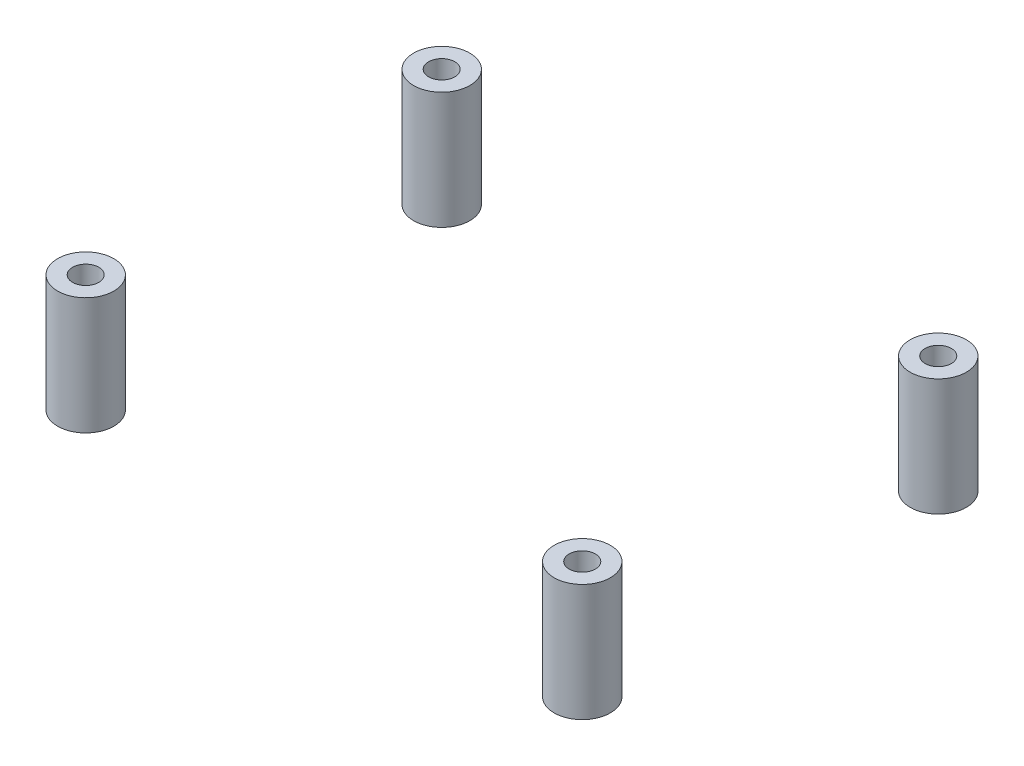
ISO-10303-21;
HEADER;
FILE_DESCRIPTION(('STEP AP214'),'2;1');
FILE_NAME('part.step','',(''),(''),'','','');
FILE_SCHEMA(('AUTOMOTIVE_DESIGN { 1 0 10303 214 1 1 1 1 }'));
ENDSEC;
DATA;
#1=APPLICATION_CONTEXT('core data for automotive mechanical design processes');
#2=APPLICATION_PROTOCOL_DEFINITION('international standard','automotive_design',2000,#1);
#3=PRODUCT_CONTEXT('',#1,'mechanical');
#4=PRODUCT('Part','Part','',(#3));
#5=PRODUCT_RELATED_PRODUCT_CATEGORY('part','',(#4));
#6=PRODUCT_DEFINITION_FORMATION('','',#4);
#7=PRODUCT_DEFINITION_CONTEXT('part definition',#1,'design');
#8=PRODUCT_DEFINITION('design','',#6,#7);
#9=PRODUCT_DEFINITION_SHAPE('','',#8);
#10=(LENGTH_UNIT() NAMED_UNIT(*) SI_UNIT(.MILLI.,.METRE.));
#11=(NAMED_UNIT(*) PLANE_ANGLE_UNIT() SI_UNIT($,.RADIAN.));
#12=(NAMED_UNIT(*) SI_UNIT($,.STERADIAN.) SOLID_ANGLE_UNIT());
#13=UNCERTAINTY_MEASURE_WITH_UNIT(LENGTH_MEASURE(1.E-05),#10,'distance_accuracy_value','');
#14=(GEOMETRIC_REPRESENTATION_CONTEXT(3) GLOBAL_UNCERTAINTY_ASSIGNED_CONTEXT((#13)) GLOBAL_UNIT_ASSIGNED_CONTEXT((#10,
#11,#12)) REPRESENTATION_CONTEXT('',''));
#15=CARTESIAN_POINT('',(0.,0.,0.));
#16=DIRECTION('',(0.,0.,1.));
#17=DIRECTION('',(1.,0.,0.));
#18=AXIS2_PLACEMENT_3D('',#15,#16,#17);
#19=CARTESIAN_POINT('',(18.7647371005469,12.5,-23.928667677178));
#20=DIRECTION('',(0.,-1.,0.));
#21=DIRECTION('',(0.,0.,-1.));
#22=AXIS2_PLACEMENT_3D('',#19,#20,#21);
#23=CYLINDRICAL_SURFACE('',#22,3.);
#24=CARTESIAN_POINT('',(18.7647371005469,12.5,-23.928667677178));
#25=DIRECTION('',(0.,1.,0.));
#26=DIRECTION('',(0.,0.,1.));
#27=AXIS2_PLACEMENT_3D('',#24,#25,#26);
#28=CIRCLE('',#27,3.);
#29=CARTESIAN_POINT('',(18.7647371005469,12.5,-20.928667677178));
#30=VERTEX_POINT('',#29);
#31=EDGE_CURVE('E11',#30,#30,#28,.T.);
#32=ORIENTED_EDGE('',*,*,#31,.F.);
#33=EDGE_LOOP('',(#32));
#34=FACE_BOUND('',#33,.T.);
#35=CARTESIAN_POINT('',(18.7647371005469,0.,-23.928667677178));
#36=DIRECTION('',(0.,1.,0.));
#37=DIRECTION('',(0.,0.,1.));
#38=AXIS2_PLACEMENT_3D('',#35,#36,#37);
#39=CIRCLE('',#38,3.);
#40=CARTESIAN_POINT('',(18.7647371005469,0.,-20.928667677178));
#41=VERTEX_POINT('',#40);
#42=EDGE_CURVE('E51',#41,#41,#39,.T.);
#43=ORIENTED_EDGE('',*,*,#42,.T.);
#44=EDGE_LOOP('',(#43));
#45=FACE_BOUND('',#44,.T.);
#46=ADVANCED_FACE('F48',(#34,#45),#23,.T.);
#47=CARTESIAN_POINT('',(0.,12.5,0.));
#48=DIRECTION('',(0.,1.,0.));
#49=DIRECTION('',(0.,0.,1.));
#50=AXIS2_PLACEMENT_3D('',#47,#48,#49);
#51=PLANE('',#50);
#52=CARTESIAN_POINT('',(18.7647371005469,12.5,-23.928667677178));
#53=DIRECTION('',(0.,1.,0.));
#54=DIRECTION('',(0.,0.,1.));
#55=AXIS2_PLACEMENT_3D('',#52,#53,#54);
#56=CIRCLE('',#55,1.4);
#57=CARTESIAN_POINT('',(18.7647371005469,12.5,-22.528667677178));
#58=VERTEX_POINT('',#57);
#59=EDGE_CURVE('E58',#58,#58,#56,.T.);
#60=ORIENTED_EDGE('',*,*,#59,.F.);
#61=EDGE_LOOP('',(#60));
#62=FACE_BOUND('',#61,.T.);
#63=ORIENTED_EDGE('',*,*,#31,.T.);
#64=EDGE_LOOP('',(#63));
#65=FACE_BOUND('',#64,.T.);
#66=ADVANCED_FACE('F68',(#62,#65),#51,.T.);
#67=CARTESIAN_POINT('',(0.,0.,0.));
#68=DIRECTION('',(0.,1.,0.));
#69=DIRECTION('',(0.,0.,1.));
#70=AXIS2_PLACEMENT_3D('',#67,#68,#69);
#71=PLANE('',#70);
#72=ORIENTED_EDGE('',*,*,#42,.F.);
#73=EDGE_LOOP('',(#72));
#74=FACE_BOUND('',#73,.T.);
#75=ADVANCED_FACE('F70',(#74),#71,.F.);
#76=CARTESIAN_POINT('',(18.7647371005469,2.5,-23.928667677178));
#77=DIRECTION('',(0.,1.,0.));
#78=DIRECTION('',(0.,0.,1.));
#79=AXIS2_PLACEMENT_3D('',#76,#77,#78);
#80=CYLINDRICAL_SURFACE('',#79,1.4);
#81=CARTESIAN_POINT('',(18.7647371005469,2.5,-23.928667677178));
#82=DIRECTION('',(0.,1.,0.));
#83=DIRECTION('',(0.,0.,1.));
#84=AXIS2_PLACEMENT_3D('',#81,#82,#83);
#85=CIRCLE('',#84,1.4);
#86=CARTESIAN_POINT('',(18.7647371005469,2.5,-22.528667677178));
#87=VERTEX_POINT('',#86);
#88=EDGE_CURVE('E60',#87,#87,#85,.T.);
#89=ORIENTED_EDGE('',*,*,#88,.F.);
#90=EDGE_LOOP('',(#89));
#91=FACE_BOUND('',#90,.T.);
#92=ORIENTED_EDGE('',*,*,#59,.T.);
#93=EDGE_LOOP('',(#92));
#94=FACE_BOUND('',#93,.T.);
#95=ADVANCED_FACE('F66',(#91,#94),#80,.F.);
#96=CARTESIAN_POINT('',(18.7647371005469,2.5,-23.928667677178));
#97=DIRECTION('',(0.,1.,0.));
#98=DIRECTION('',(0.,0.,1.));
#99=AXIS2_PLACEMENT_3D('',#96,#97,#98);
#100=PLANE('',#99);
#101=ORIENTED_EDGE('',*,*,#88,.T.);
#102=EDGE_LOOP('',(#101));
#103=FACE_BOUND('',#102,.T.);
#104=ADVANCED_FACE('F80',(#103),#100,.T.);
#105=CLOSED_SHELL('',(#46,#66,#75,#95,#104));
#106=MANIFOLD_SOLID_BREP('B2',#105);
#107=CARTESIAN_POINT('',(18.7647371005469,12.5,14.071332322822));
#108=DIRECTION('',(0.,-1.,0.));
#109=DIRECTION('',(0.,0.,-1.));
#110=AXIS2_PLACEMENT_3D('',#107,#108,#109);
#111=CYLINDRICAL_SURFACE('',#110,3.);
#112=CARTESIAN_POINT('',(18.7647371005469,12.5,14.071332322822));
#113=DIRECTION('',(0.,1.,0.));
#114=DIRECTION('',(0.,0.,1.));
#115=AXIS2_PLACEMENT_3D('',#112,#113,#114);
#116=CIRCLE('',#115,3.);
#117=CARTESIAN_POINT('',(18.7647371005469,12.5,17.071332322822));
#118=VERTEX_POINT('',#117);
#119=EDGE_CURVE('E47',#118,#118,#116,.T.);
#120=ORIENTED_EDGE('',*,*,#119,.F.);
#121=EDGE_LOOP('',(#120));
#122=FACE_BOUND('',#121,.T.);
#123=CARTESIAN_POINT('',(18.7647371005469,0.,14.071332322822));
#124=DIRECTION('',(0.,1.,0.));
#125=DIRECTION('',(0.,0.,1.));
#126=AXIS2_PLACEMENT_3D('',#123,#124,#125);
#127=CIRCLE('',#126,3.);
#128=CARTESIAN_POINT('',(18.7647371005469,0.,17.071332322822));
#129=VERTEX_POINT('',#128);
#130=EDGE_CURVE('E130',#129,#129,#127,.T.);
#131=ORIENTED_EDGE('',*,*,#130,.T.);
#132=EDGE_LOOP('',(#131));
#133=FACE_BOUND('',#132,.T.);
#134=ADVANCED_FACE('F127',(#122,#133),#111,.T.);
#135=CARTESIAN_POINT('',(0.,12.5,0.));
#136=DIRECTION('',(0.,1.,0.));
#137=DIRECTION('',(0.,0.,1.));
#138=AXIS2_PLACEMENT_3D('',#135,#136,#137);
#139=PLANE('',#138);
#140=CARTESIAN_POINT('',(18.7647371005469,12.5,14.071332322822));
#141=DIRECTION('',(0.,1.,0.));
#142=DIRECTION('',(0.,0.,1.));
#143=AXIS2_PLACEMENT_3D('',#140,#141,#142);
#144=CIRCLE('',#143,1.4);
#145=CARTESIAN_POINT('',(18.7647371005469,12.5,15.471332322822));
#146=VERTEX_POINT('',#145);
#147=EDGE_CURVE('E137',#146,#146,#144,.T.);
#148=ORIENTED_EDGE('',*,*,#147,.F.);
#149=EDGE_LOOP('',(#148));
#150=FACE_BOUND('',#149,.T.);
#151=ORIENTED_EDGE('',*,*,#119,.T.);
#152=EDGE_LOOP('',(#151));
#153=FACE_BOUND('',#152,.T.);
#154=ADVANCED_FACE('F147',(#150,#153),#139,.T.);
#155=CARTESIAN_POINT('',(0.,0.,0.));
#156=DIRECTION('',(0.,1.,0.));
#157=DIRECTION('',(0.,0.,1.));
#158=AXIS2_PLACEMENT_3D('',#155,#156,#157);
#159=PLANE('',#158);
#160=ORIENTED_EDGE('',*,*,#130,.F.);
#161=EDGE_LOOP('',(#160));
#162=FACE_BOUND('',#161,.T.);
#163=ADVANCED_FACE('F149',(#162),#159,.F.);
#164=CARTESIAN_POINT('',(18.7647371005469,2.5,14.071332322822));
#165=DIRECTION('',(0.,1.,0.));
#166=DIRECTION('',(0.,0.,1.));
#167=AXIS2_PLACEMENT_3D('',#164,#165,#166);
#168=CYLINDRICAL_SURFACE('',#167,1.4);
#169=CARTESIAN_POINT('',(18.7647371005469,2.5,14.071332322822));
#170=DIRECTION('',(0.,1.,0.));
#171=DIRECTION('',(0.,0.,1.));
#172=AXIS2_PLACEMENT_3D('',#169,#170,#171);
#173=CIRCLE('',#172,1.4);
#174=CARTESIAN_POINT('',(18.7647371005469,2.5,15.471332322822));
#175=VERTEX_POINT('',#174);
#176=EDGE_CURVE('E139',#175,#175,#173,.T.);
#177=ORIENTED_EDGE('',*,*,#176,.F.);
#178=EDGE_LOOP('',(#177));
#179=FACE_BOUND('',#178,.T.);
#180=ORIENTED_EDGE('',*,*,#147,.T.);
#181=EDGE_LOOP('',(#180));
#182=FACE_BOUND('',#181,.T.);
#183=ADVANCED_FACE('F145',(#179,#182),#168,.F.);
#184=CARTESIAN_POINT('',(18.7647371005469,2.5,14.071332322822));
#185=DIRECTION('',(0.,1.,0.));
#186=DIRECTION('',(0.,0.,1.));
#187=AXIS2_PLACEMENT_3D('',#184,#185,#186);
#188=PLANE('',#187);
#189=ORIENTED_EDGE('',*,*,#176,.T.);
#190=EDGE_LOOP('',(#189));
#191=FACE_BOUND('',#190,.T.);
#192=ADVANCED_FACE('F159',(#191),#188,.T.);
#193=CLOSED_SHELL('',(#134,#154,#163,#183,#192));
#194=MANIFOLD_SOLID_BREP('B6',#193);
#195=CARTESIAN_POINT('',(-34.2352628994531,12.5,14.071332322822));
#196=DIRECTION('',(0.,-1.,0.));
#197=DIRECTION('',(0.,0.,-1.));
#198=AXIS2_PLACEMENT_3D('',#195,#196,#197);
#199=CYLINDRICAL_SURFACE('',#198,3.);
#200=CARTESIAN_POINT('',(-34.2352628994531,12.5,14.071332322822));
#201=DIRECTION('',(0.,1.,0.));
#202=DIRECTION('',(0.,0.,1.));
#203=AXIS2_PLACEMENT_3D('',#200,#201,#202);
#204=CIRCLE('',#203,3.);
#205=CARTESIAN_POINT('',(-34.2352628994531,12.5,17.071332322822));
#206=VERTEX_POINT('',#205);
#207=EDGE_CURVE('E126',#206,#206,#204,.T.);
#208=ORIENTED_EDGE('',*,*,#207,.F.);
#209=EDGE_LOOP('',(#208));
#210=FACE_BOUND('',#209,.T.);
#211=CARTESIAN_POINT('',(-34.2352628994531,0.,14.071332322822));
#212=DIRECTION('',(0.,1.,0.));
#213=DIRECTION('',(0.,0.,1.));
#214=AXIS2_PLACEMENT_3D('',#211,#212,#213);
#215=CIRCLE('',#214,3.);
#216=CARTESIAN_POINT('',(-34.2352628994531,0.,17.071332322822));
#217=VERTEX_POINT('',#216);
#218=EDGE_CURVE('E208',#217,#217,#215,.T.);
#219=ORIENTED_EDGE('',*,*,#218,.T.);
#220=EDGE_LOOP('',(#219));
#221=FACE_BOUND('',#220,.T.);
#222=ADVANCED_FACE('F205',(#210,#221),#199,.T.);
#223=CARTESIAN_POINT('',(0.,12.5,0.));
#224=DIRECTION('',(0.,1.,0.));
#225=DIRECTION('',(0.,0.,1.));
#226=AXIS2_PLACEMENT_3D('',#223,#224,#225);
#227=PLANE('',#226);
#228=CARTESIAN_POINT('',(-34.2352628994531,12.5,14.071332322822));
#229=DIRECTION('',(0.,1.,0.));
#230=DIRECTION('',(0.,0.,1.));
#231=AXIS2_PLACEMENT_3D('',#228,#229,#230);
#232=CIRCLE('',#231,1.4);
#233=CARTESIAN_POINT('',(-34.2352628994531,12.5,15.471332322822));
#234=VERTEX_POINT('',#233);
#235=EDGE_CURVE('E215',#234,#234,#232,.T.);
#236=ORIENTED_EDGE('',*,*,#235,.F.);
#237=EDGE_LOOP('',(#236));
#238=FACE_BOUND('',#237,.T.);
#239=ORIENTED_EDGE('',*,*,#207,.T.);
#240=EDGE_LOOP('',(#239));
#241=FACE_BOUND('',#240,.T.);
#242=ADVANCED_FACE('F225',(#238,#241),#227,.T.);
#243=CARTESIAN_POINT('',(0.,0.,0.));
#244=DIRECTION('',(0.,1.,0.));
#245=DIRECTION('',(0.,0.,1.));
#246=AXIS2_PLACEMENT_3D('',#243,#244,#245);
#247=PLANE('',#246);
#248=ORIENTED_EDGE('',*,*,#218,.F.);
#249=EDGE_LOOP('',(#248));
#250=FACE_BOUND('',#249,.T.);
#251=ADVANCED_FACE('F227',(#250),#247,.F.);
#252=CARTESIAN_POINT('',(-34.2352628994531,2.5,14.071332322822));
#253=DIRECTION('',(0.,1.,0.));
#254=DIRECTION('',(0.,0.,1.));
#255=AXIS2_PLACEMENT_3D('',#252,#253,#254);
#256=CYLINDRICAL_SURFACE('',#255,1.4);
#257=CARTESIAN_POINT('',(-34.2352628994531,2.5,14.071332322822));
#258=DIRECTION('',(0.,1.,0.));
#259=DIRECTION('',(0.,0.,1.));
#260=AXIS2_PLACEMENT_3D('',#257,#258,#259);
#261=CIRCLE('',#260,1.4);
#262=CARTESIAN_POINT('',(-34.2352628994531,2.5,15.471332322822));
#263=VERTEX_POINT('',#262);
#264=EDGE_CURVE('E217',#263,#263,#261,.T.);
#265=ORIENTED_EDGE('',*,*,#264,.F.);
#266=EDGE_LOOP('',(#265));
#267=FACE_BOUND('',#266,.T.);
#268=ORIENTED_EDGE('',*,*,#235,.T.);
#269=EDGE_LOOP('',(#268));
#270=FACE_BOUND('',#269,.T.);
#271=ADVANCED_FACE('F223',(#267,#270),#256,.F.);
#272=CARTESIAN_POINT('',(-34.2352628994531,2.5,14.071332322822));
#273=DIRECTION('',(0.,1.,0.));
#274=DIRECTION('',(0.,0.,1.));
#275=AXIS2_PLACEMENT_3D('',#272,#273,#274);
#276=PLANE('',#275);
#277=ORIENTED_EDGE('',*,*,#264,.T.);
#278=EDGE_LOOP('',(#277));
#279=FACE_BOUND('',#278,.T.);
#280=ADVANCED_FACE('F237',(#279),#276,.T.);
#281=CLOSED_SHELL('',(#222,#242,#251,#271,#280));
#282=MANIFOLD_SOLID_BREP('B42',#281);
#283=CARTESIAN_POINT('',(-34.2352628994531,12.5,-23.928667677178));
#284=DIRECTION('',(0.,-1.,0.));
#285=DIRECTION('',(0.,0.,-1.));
#286=AXIS2_PLACEMENT_3D('',#283,#284,#285);
#287=CYLINDRICAL_SURFACE('',#286,3.);
#288=CARTESIAN_POINT('',(-34.2352628994531,12.5,-23.928667677178));
#289=DIRECTION('',(0.,1.,0.));
#290=DIRECTION('',(0.,0.,1.));
#291=AXIS2_PLACEMENT_3D('',#288,#289,#290);
#292=CIRCLE('',#291,3.);
#293=CARTESIAN_POINT('',(-34.2352628994531,12.5,-20.928667677178));
#294=VERTEX_POINT('',#293);
#295=EDGE_CURVE('E204',#294,#294,#292,.T.);
#296=ORIENTED_EDGE('',*,*,#295,.F.);
#297=EDGE_LOOP('',(#296));
#298=FACE_BOUND('',#297,.T.);
#299=CARTESIAN_POINT('',(-34.2352628994531,0.,-23.928667677178));
#300=DIRECTION('',(0.,1.,0.));
#301=DIRECTION('',(0.,0.,1.));
#302=AXIS2_PLACEMENT_3D('',#299,#300,#301);
#303=CIRCLE('',#302,3.);
#304=CARTESIAN_POINT('',(-34.2352628994531,0.,-20.928667677178));
#305=VERTEX_POINT('',#304);
#306=EDGE_CURVE('E279',#305,#305,#303,.T.);
#307=ORIENTED_EDGE('',*,*,#306,.T.);
#308=EDGE_LOOP('',(#307));
#309=FACE_BOUND('',#308,.T.);
#310=ADVANCED_FACE('F276',(#298,#309),#287,.T.);
#311=CARTESIAN_POINT('',(0.,12.5,0.));
#312=DIRECTION('',(0.,1.,0.));
#313=DIRECTION('',(0.,0.,1.));
#314=AXIS2_PLACEMENT_3D('',#311,#312,#313);
#315=PLANE('',#314);
#316=CARTESIAN_POINT('',(-34.2352628994531,12.5,-23.928667677178));
#317=DIRECTION('',(0.,1.,0.));
#318=DIRECTION('',(0.,0.,1.));
#319=AXIS2_PLACEMENT_3D('',#316,#317,#318);
#320=CIRCLE('',#319,1.4);
#321=CARTESIAN_POINT('',(-34.2352628994531,12.5,-22.528667677178));
#322=VERTEX_POINT('',#321);
#323=EDGE_CURVE('E288',#322,#322,#320,.T.);
#324=ORIENTED_EDGE('',*,*,#323,.F.);
#325=EDGE_LOOP('',(#324));
#326=FACE_BOUND('',#325,.T.);
#327=ORIENTED_EDGE('',*,*,#295,.T.);
#328=EDGE_LOOP('',(#327));
#329=FACE_BOUND('',#328,.T.);
#330=ADVANCED_FACE('F303',(#326,#329),#315,.T.);
#331=CARTESIAN_POINT('',(0.,0.,0.));
#332=DIRECTION('',(0.,1.,0.));
#333=DIRECTION('',(0.,0.,1.));
#334=AXIS2_PLACEMENT_3D('',#331,#332,#333);
#335=PLANE('',#334);
#336=ORIENTED_EDGE('',*,*,#306,.F.);
#337=EDGE_LOOP('',(#336));
#338=FACE_BOUND('',#337,.T.);
#339=ADVANCED_FACE('F299',(#338),#335,.F.);
#340=CARTESIAN_POINT('',(-34.2352628994531,2.5,-23.928667677178));
#341=DIRECTION('',(0.,1.,0.));
#342=DIRECTION('',(0.,0.,1.));
#343=AXIS2_PLACEMENT_3D('',#340,#341,#342);
#344=CYLINDRICAL_SURFACE('',#343,1.4);
#345=CARTESIAN_POINT('',(-34.2352628994531,2.5,-23.928667677178));
#346=DIRECTION('',(0.,1.,0.));
#347=DIRECTION('',(0.,0.,1.));
#348=AXIS2_PLACEMENT_3D('',#345,#346,#347);
#349=CIRCLE('',#348,1.4);
#350=CARTESIAN_POINT('',(-34.2352628994531,2.5,-22.528667677178));
#351=VERTEX_POINT('',#350);
#352=EDGE_CURVE('E286',#351,#351,#349,.T.);
#353=ORIENTED_EDGE('',*,*,#352,.F.);
#354=EDGE_LOOP('',(#353));
#355=FACE_BOUND('',#354,.T.);
#356=ORIENTED_EDGE('',*,*,#323,.T.);
#357=EDGE_LOOP('',(#356));
#358=FACE_BOUND('',#357,.T.);
#359=ADVANCED_FACE('F296',(#355,#358),#344,.F.);
#360=CARTESIAN_POINT('',(-34.2352628994531,2.5,-23.928667677178));
#361=DIRECTION('',(0.,1.,0.));
#362=DIRECTION('',(0.,0.,1.));
#363=AXIS2_PLACEMENT_3D('',#360,#361,#362);
#364=PLANE('',#363);
#365=ORIENTED_EDGE('',*,*,#352,.T.);
#366=EDGE_LOOP('',(#365));
#367=FACE_BOUND('',#366,.T.);
#368=ADVANCED_FACE('F294',(#367),#364,.T.);
#369=CLOSED_SHELL('',(#310,#330,#339,#359,#368));
#370=MANIFOLD_SOLID_BREP('B121',#369);
#371=ADVANCED_BREP_SHAPE_REPRESENTATION('',(#18,#106,#194,#282,#370),#14);
#372=SHAPE_DEFINITION_REPRESENTATION(#9,#371);
ENDSEC;
END-ISO-10303-21;
